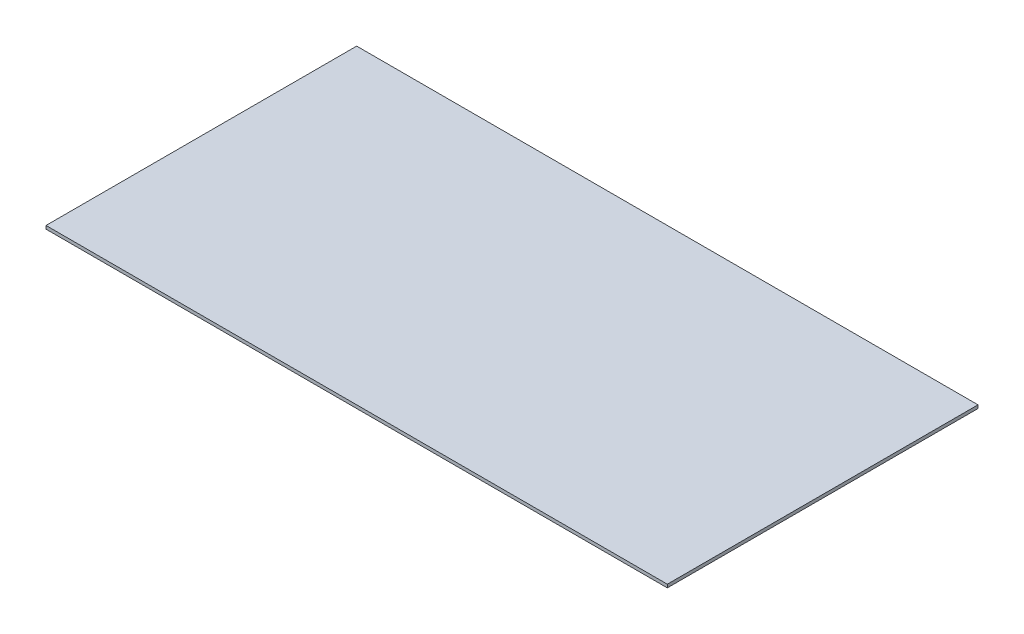
ISO-10303-21;
HEADER;
FILE_DESCRIPTION(('STEP AP214'),'2;1');
FILE_NAME('part.step','',(''),(''),'','','');
FILE_SCHEMA(('AUTOMOTIVE_DESIGN { 1 0 10303 214 1 1 1 1 }'));
ENDSEC;
DATA;
#1=APPLICATION_CONTEXT('core data for automotive mechanical design processes');
#2=APPLICATION_PROTOCOL_DEFINITION('international standard','automotive_design',2000,#1);
#3=PRODUCT_CONTEXT('',#1,'mechanical');
#4=PRODUCT('Part','Part','',(#3));
#5=PRODUCT_RELATED_PRODUCT_CATEGORY('part','',(#4));
#6=PRODUCT_DEFINITION_FORMATION('','',#4);
#7=PRODUCT_DEFINITION_CONTEXT('part definition',#1,'design');
#8=PRODUCT_DEFINITION('design','',#6,#7);
#9=PRODUCT_DEFINITION_SHAPE('','',#8);
#10=(LENGTH_UNIT() NAMED_UNIT(*) SI_UNIT(.MILLI.,.METRE.));
#11=(NAMED_UNIT(*) PLANE_ANGLE_UNIT() SI_UNIT($,.RADIAN.));
#12=(NAMED_UNIT(*) SI_UNIT($,.STERADIAN.) SOLID_ANGLE_UNIT());
#13=UNCERTAINTY_MEASURE_WITH_UNIT(LENGTH_MEASURE(1.E-05),#10,'distance_accuracy_value','');
#14=(GEOMETRIC_REPRESENTATION_CONTEXT(3) GLOBAL_UNCERTAINTY_ASSIGNED_CONTEXT((#13)) GLOBAL_UNIT_ASSIGNED_CONTEXT((#10,
#11,#12)) REPRESENTATION_CONTEXT('',''));
#15=CARTESIAN_POINT('',(0.,0.,0.));
#16=DIRECTION('',(0.,0.,1.));
#17=DIRECTION('',(1.,0.,0.));
#18=AXIS2_PLACEMENT_3D('',#15,#16,#17);
#19=CARTESIAN_POINT('',(609.6,6.35,304.8));
#20=DIRECTION('',(-1.,0.,0.));
#21=DIRECTION('',(0.,0.,1.));
#22=AXIS2_PLACEMENT_3D('',#19,#20,#21);
#23=PLANE('',#22);
#24=DIRECTION('',(0.,0.,-1.));
#25=VECTOR('',#24,1.);
#26=CARTESIAN_POINT('',(609.6,0.,304.8));
#27=LINE('',#26,#25);
#28=CARTESIAN_POINT('',(609.6,0.,304.8));
#29=VERTEX_POINT('',#28);
#30=CARTESIAN_POINT('',(609.6,0.,-304.8));
#31=VERTEX_POINT('',#30);
#32=EDGE_CURVE('E111',#29,#31,#27,.T.);
#33=ORIENTED_EDGE('',*,*,#32,.T.);
#34=DIRECTION('',(0.,-1.,0.));
#35=VECTOR('',#34,1.);
#36=CARTESIAN_POINT('',(609.6,6.35,-304.8));
#37=LINE('',#36,#35);
#38=CARTESIAN_POINT('',(609.6,6.35,-304.8));
#39=VERTEX_POINT('',#38);
#40=EDGE_CURVE('E11',#39,#31,#37,.T.);
#41=ORIENTED_EDGE('',*,*,#40,.F.);
#42=DIRECTION('',(0.,0.,-1.));
#43=VECTOR('',#42,1.);
#44=CARTESIAN_POINT('',(609.6,6.35,304.8));
#45=LINE('',#44,#43);
#46=CARTESIAN_POINT('',(609.6,6.35,304.8));
#47=VERTEX_POINT('',#46);
#48=EDGE_CURVE('E95',#47,#39,#45,.T.);
#49=ORIENTED_EDGE('',*,*,#48,.F.);
#50=DIRECTION('',(0.,-1.,0.));
#51=VECTOR('',#50,1.);
#52=CARTESIAN_POINT('',(609.6,6.35,304.8));
#53=LINE('',#52,#51);
#54=EDGE_CURVE('E107',#47,#29,#53,.T.);
#55=ORIENTED_EDGE('',*,*,#54,.T.);
#56=EDGE_LOOP('',(#33,#41,#49,#55));
#57=FACE_BOUND('',#56,.T.);
#58=ADVANCED_FACE('F43',(#57),#23,.F.);
#59=CARTESIAN_POINT('',(-609.6,6.35,-304.8));
#60=DIRECTION('',(0.,0.,1.));
#61=DIRECTION('',(1.,0.,0.));
#62=AXIS2_PLACEMENT_3D('',#59,#60,#61);
#63=PLANE('',#62);
#64=DIRECTION('',(-1.,0.,0.));
#65=VECTOR('',#64,1.);
#66=CARTESIAN_POINT('',(-609.6,0.,-304.8));
#67=LINE('',#66,#65);
#68=CARTESIAN_POINT('',(-609.6,0.,-304.8));
#69=VERTEX_POINT('',#68);
#70=EDGE_CURVE('E100',#31,#69,#67,.T.);
#71=ORIENTED_EDGE('',*,*,#70,.T.);
#72=DIRECTION('',(0.,-1.,0.));
#73=VECTOR('',#72,1.);
#74=CARTESIAN_POINT('',(-609.6,6.35,-304.8));
#75=LINE('',#74,#73);
#76=CARTESIAN_POINT('',(-609.6,6.35,-304.8));
#77=VERTEX_POINT('',#76);
#78=EDGE_CURVE('E52',#77,#69,#75,.T.);
#79=ORIENTED_EDGE('',*,*,#78,.F.);
#80=DIRECTION('',(-1.,0.,0.));
#81=VECTOR('',#80,1.);
#82=CARTESIAN_POINT('',(-609.6,6.35,-304.8));
#83=LINE('',#82,#81);
#84=EDGE_CURVE('E90',#39,#77,#83,.T.);
#85=ORIENTED_EDGE('',*,*,#84,.F.);
#86=ORIENTED_EDGE('',*,*,#40,.T.);
#87=EDGE_LOOP('',(#71,#79,#85,#86));
#88=FACE_BOUND('',#87,.T.);
#89=ADVANCED_FACE('F99',(#88),#63,.F.);
#90=CARTESIAN_POINT('',(-609.6,6.35,304.8));
#91=DIRECTION('',(1.,0.,0.));
#92=DIRECTION('',(0.,0.,-1.));
#93=AXIS2_PLACEMENT_3D('',#90,#91,#92);
#94=PLANE('',#93);
#95=DIRECTION('',(0.,0.,1.));
#96=VECTOR('',#95,1.);
#97=CARTESIAN_POINT('',(-609.6,0.,304.8));
#98=LINE('',#97,#96);
#99=CARTESIAN_POINT('',(-609.6,0.,304.8));
#100=VERTEX_POINT('',#99);
#101=EDGE_CURVE('E77',#69,#100,#98,.T.);
#102=ORIENTED_EDGE('',*,*,#101,.T.);
#103=DIRECTION('',(0.,-1.,0.));
#104=VECTOR('',#103,1.);
#105=CARTESIAN_POINT('',(-609.6,6.35,304.8));
#106=LINE('',#105,#104);
#107=CARTESIAN_POINT('',(-609.6,6.35,304.8));
#108=VERTEX_POINT('',#107);
#109=EDGE_CURVE('E102',#108,#100,#106,.T.);
#110=ORIENTED_EDGE('',*,*,#109,.F.);
#111=DIRECTION('',(0.,0.,1.));
#112=VECTOR('',#111,1.);
#113=CARTESIAN_POINT('',(-609.6,6.35,304.8));
#114=LINE('',#113,#112);
#115=EDGE_CURVE('E93',#77,#108,#114,.T.);
#116=ORIENTED_EDGE('',*,*,#115,.F.);
#117=ORIENTED_EDGE('',*,*,#78,.T.);
#118=EDGE_LOOP('',(#102,#110,#116,#117));
#119=FACE_BOUND('',#118,.T.);
#120=ADVANCED_FACE('F103',(#119),#94,.F.);
#121=CARTESIAN_POINT('',(-609.6,6.35,304.8));
#122=DIRECTION('',(0.,0.,-1.));
#123=DIRECTION('',(-1.,0.,0.));
#124=AXIS2_PLACEMENT_3D('',#121,#122,#123);
#125=PLANE('',#124);
#126=DIRECTION('',(1.,0.,0.));
#127=VECTOR('',#126,1.);
#128=CARTESIAN_POINT('',(-609.6,0.,304.8));
#129=LINE('',#128,#127);
#130=EDGE_CURVE('E83',#100,#29,#129,.T.);
#131=ORIENTED_EDGE('',*,*,#130,.T.);
#132=ORIENTED_EDGE('',*,*,#54,.F.);
#133=DIRECTION('',(1.,0.,0.));
#134=VECTOR('',#133,1.);
#135=CARTESIAN_POINT('',(-609.6,6.35,304.8));
#136=LINE('',#135,#134);
#137=EDGE_CURVE('E60',#108,#47,#136,.T.);
#138=ORIENTED_EDGE('',*,*,#137,.F.);
#139=ORIENTED_EDGE('',*,*,#109,.T.);
#140=EDGE_LOOP('',(#131,#132,#138,#139));
#141=FACE_BOUND('',#140,.T.);
#142=ADVANCED_FACE('F124',(#141),#125,.F.);
#143=CARTESIAN_POINT('',(0.,6.35,0.));
#144=DIRECTION('',(0.,-1.,0.));
#145=DIRECTION('',(0.,0.,-1.));
#146=AXIS2_PLACEMENT_3D('',#143,#144,#145);
#147=PLANE('',#146);
#148=ORIENTED_EDGE('',*,*,#48,.T.);
#149=ORIENTED_EDGE('',*,*,#84,.T.);
#150=ORIENTED_EDGE('',*,*,#115,.T.);
#151=ORIENTED_EDGE('',*,*,#137,.T.);
#152=EDGE_LOOP('',(#148,#149,#150,#151));
#153=FACE_BOUND('',#152,.T.);
#154=ADVANCED_FACE('F91',(#153),#147,.F.);
#155=CARTESIAN_POINT('',(0.,0.,0.));
#156=DIRECTION('',(0.,-1.,0.));
#157=DIRECTION('',(0.,0.,-1.));
#158=AXIS2_PLACEMENT_3D('',#155,#156,#157);
#159=PLANE('',#158);
#160=ORIENTED_EDGE('',*,*,#32,.F.);
#161=ORIENTED_EDGE('',*,*,#130,.F.);
#162=ORIENTED_EDGE('',*,*,#101,.F.);
#163=ORIENTED_EDGE('',*,*,#70,.F.);
#164=EDGE_LOOP('',(#160,#161,#162,#163));
#165=FACE_BOUND('',#164,.T.);
#166=ADVANCED_FACE('F127',(#165),#159,.T.);
#167=CLOSED_SHELL('',(#58,#89,#120,#142,#154,#166));
#168=MANIFOLD_SOLID_BREP('B2',#167);
#169=ADVANCED_BREP_SHAPE_REPRESENTATION('',(#18,#168),#14);
#170=SHAPE_DEFINITION_REPRESENTATION(#9,#169);
ENDSEC;
END-ISO-10303-21;
